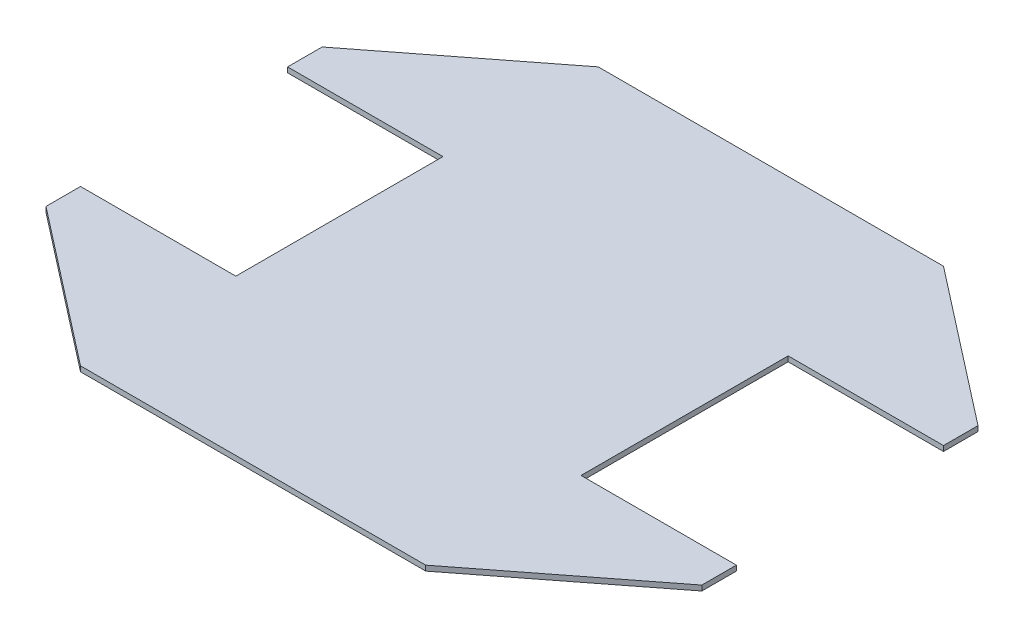
ISO-10303-21;
HEADER;
FILE_DESCRIPTION(('STEP AP214'),'2;1');
FILE_NAME('part.step','',(''),(''),'','','');
FILE_SCHEMA(('AUTOMOTIVE_DESIGN { 1 0 10303 214 1 1 1 1 }'));
ENDSEC;
DATA;
#1=APPLICATION_CONTEXT('core data for automotive mechanical design processes');
#2=APPLICATION_PROTOCOL_DEFINITION('international standard','automotive_design',2000,#1);
#3=PRODUCT_CONTEXT('',#1,'mechanical');
#4=PRODUCT('Part','Part','',(#3));
#5=PRODUCT_RELATED_PRODUCT_CATEGORY('part','',(#4));
#6=PRODUCT_DEFINITION_FORMATION('','',#4);
#7=PRODUCT_DEFINITION_CONTEXT('part definition',#1,'design');
#8=PRODUCT_DEFINITION('design','',#6,#7);
#9=PRODUCT_DEFINITION_SHAPE('','',#8);
#10=(LENGTH_UNIT() NAMED_UNIT(*) SI_UNIT(.MILLI.,.METRE.));
#11=(NAMED_UNIT(*) PLANE_ANGLE_UNIT() SI_UNIT($,.RADIAN.));
#12=(NAMED_UNIT(*) SI_UNIT($,.STERADIAN.) SOLID_ANGLE_UNIT());
#13=UNCERTAINTY_MEASURE_WITH_UNIT(LENGTH_MEASURE(1.E-05),#10,'distance_accuracy_value','');
#14=(GEOMETRIC_REPRESENTATION_CONTEXT(3) GLOBAL_UNCERTAINTY_ASSIGNED_CONTEXT((#13)) GLOBAL_UNIT_ASSIGNED_CONTEXT((#10,
#11,#12)) REPRESENTATION_CONTEXT('',''));
#15=CARTESIAN_POINT('',(0.,0.,0.));
#16=DIRECTION('',(0.,0.,1.));
#17=DIRECTION('',(1.,0.,0.));
#18=AXIS2_PLACEMENT_3D('',#15,#16,#17);
#19=CARTESIAN_POINT('',(-190.,3.,-80.));
#20=DIRECTION('',(0.61394061351492,0.,0.789352217376326));
#21=DIRECTION('',(0.789352217376326,0.,-0.613940613514921));
#22=AXIS2_PLACEMENT_3D('',#19,#20,#21);
#23=PLANE('',#22);
#24=DIRECTION('',(-0.789352217376326,0.,0.613940613514921));
#25=VECTOR('',#24,1.);
#26=CARTESIAN_POINT('',(-190.,0.,-80.));
#27=LINE('',#26,#25);
#28=CARTESIAN_POINT('',(-100.,0.,-150.));
#29=VERTEX_POINT('',#28);
#30=CARTESIAN_POINT('',(-190.,0.,-80.));
#31=VERTEX_POINT('',#30);
#32=EDGE_CURVE('E177',#29,#31,#27,.T.);
#33=ORIENTED_EDGE('',*,*,#32,.T.);
#34=DIRECTION('',(0.,-1.,0.));
#35=VECTOR('',#34,1.);
#36=CARTESIAN_POINT('',(-190.,3.,-80.));
#37=LINE('',#36,#35);
#38=CARTESIAN_POINT('',(-190.,3.,-80.));
#39=VERTEX_POINT('',#38);
#40=EDGE_CURVE('E11',#39,#31,#37,.T.);
#41=ORIENTED_EDGE('',*,*,#40,.F.);
#42=DIRECTION('',(-0.789352217376326,0.,0.613940613514921));
#43=VECTOR('',#42,1.);
#44=CARTESIAN_POINT('',(-190.,3.,-80.));
#45=LINE('',#44,#43);
#46=CARTESIAN_POINT('',(-100.,3.,-150.));
#47=VERTEX_POINT('',#46);
#48=EDGE_CURVE('E207',#47,#39,#45,.T.);
#49=ORIENTED_EDGE('',*,*,#48,.F.);
#50=DIRECTION('',(0.,-1.,0.));
#51=VECTOR('',#50,1.);
#52=CARTESIAN_POINT('',(-100.,3.,-150.));
#53=LINE('',#52,#51);
#54=EDGE_CURVE('E173',#47,#29,#53,.T.);
#55=ORIENTED_EDGE('',*,*,#54,.T.);
#56=EDGE_LOOP('',(#33,#41,#49,#55));
#57=FACE_BOUND('',#56,.T.);
#58=ADVANCED_FACE('F33',(#57),#23,.F.);
#59=CARTESIAN_POINT('',(-190.,3.,-60.));
#60=DIRECTION('',(1.,0.,0.));
#61=DIRECTION('',(0.,0.,-1.));
#62=AXIS2_PLACEMENT_3D('',#59,#60,#61);
#63=PLANE('',#62);
#64=DIRECTION('',(0.,0.,1.));
#65=VECTOR('',#64,1.);
#66=CARTESIAN_POINT('',(-190.,0.,-60.));
#67=LINE('',#66,#65);
#68=CARTESIAN_POINT('',(-190.,0.,-60.));
#69=VERTEX_POINT('',#68);
#70=EDGE_CURVE('E180',#31,#69,#67,.T.);
#71=ORIENTED_EDGE('',*,*,#70,.T.);
#72=DIRECTION('',(0.,-1.,0.));
#73=VECTOR('',#72,1.);
#74=CARTESIAN_POINT('',(-190.,3.,-60.));
#75=LINE('',#74,#73);
#76=CARTESIAN_POINT('',(-190.,3.,-60.));
#77=VERTEX_POINT('',#76);
#78=EDGE_CURVE('E41',#77,#69,#75,.T.);
#79=ORIENTED_EDGE('',*,*,#78,.F.);
#80=DIRECTION('',(0.,0.,1.));
#81=VECTOR('',#80,1.);
#82=CARTESIAN_POINT('',(-190.,3.,-60.));
#83=LINE('',#82,#81);
#84=EDGE_CURVE('E116',#39,#77,#83,.T.);
#85=ORIENTED_EDGE('',*,*,#84,.F.);
#86=ORIENTED_EDGE('',*,*,#40,.T.);
#87=EDGE_LOOP('',(#71,#79,#85,#86));
#88=FACE_BOUND('',#87,.T.);
#89=ADVANCED_FACE('F305',(#88),#63,.F.);
#90=CARTESIAN_POINT('',(-100.,3.,-60.));
#91=DIRECTION('',(0.,0.,-1.));
#92=DIRECTION('',(-1.,0.,0.));
#93=AXIS2_PLACEMENT_3D('',#90,#91,#92);
#94=PLANE('',#93);
#95=DIRECTION('',(1.,0.,0.));
#96=VECTOR('',#95,1.);
#97=CARTESIAN_POINT('',(-100.,0.,-60.));
#98=LINE('',#97,#96);
#99=CARTESIAN_POINT('',(-100.,0.,-60.));
#100=VERTEX_POINT('',#99);
#101=EDGE_CURVE('E182',#69,#100,#98,.T.);
#102=ORIENTED_EDGE('',*,*,#101,.T.);
#103=DIRECTION('',(0.,-1.,0.));
#104=VECTOR('',#103,1.);
#105=CARTESIAN_POINT('',(-100.,3.,-60.));
#106=LINE('',#105,#104);
#107=CARTESIAN_POINT('',(-100.,3.,-60.));
#108=VERTEX_POINT('',#107);
#109=EDGE_CURVE('E238',#108,#100,#106,.T.);
#110=ORIENTED_EDGE('',*,*,#109,.F.);
#111=DIRECTION('',(1.,0.,0.));
#112=VECTOR('',#111,1.);
#113=CARTESIAN_POINT('',(-100.,3.,-60.));
#114=LINE('',#113,#112);
#115=EDGE_CURVE('E246',#77,#108,#114,.T.);
#116=ORIENTED_EDGE('',*,*,#115,.F.);
#117=ORIENTED_EDGE('',*,*,#78,.T.);
#118=EDGE_LOOP('',(#102,#110,#116,#117));
#119=FACE_BOUND('',#118,.T.);
#120=ADVANCED_FACE('F244',(#119),#94,.F.);
#121=CARTESIAN_POINT('',(-100.,3.,60.));
#122=DIRECTION('',(1.,0.,0.));
#123=DIRECTION('',(0.,0.,-1.));
#124=AXIS2_PLACEMENT_3D('',#121,#122,#123);
#125=PLANE('',#124);
#126=DIRECTION('',(0.,0.,1.));
#127=VECTOR('',#126,1.);
#128=CARTESIAN_POINT('',(-100.,0.,60.));
#129=LINE('',#128,#127);
#130=CARTESIAN_POINT('',(-100.,0.,60.));
#131=VERTEX_POINT('',#130);
#132=EDGE_CURVE('E184',#100,#131,#129,.T.);
#133=ORIENTED_EDGE('',*,*,#132,.T.);
#134=DIRECTION('',(0.,-1.,0.));
#135=VECTOR('',#134,1.);
#136=CARTESIAN_POINT('',(-100.,3.,60.));
#137=LINE('',#136,#135);
#138=CARTESIAN_POINT('',(-100.,3.,60.));
#139=VERTEX_POINT('',#138);
#140=EDGE_CURVE('E235',#139,#131,#137,.T.);
#141=ORIENTED_EDGE('',*,*,#140,.F.);
#142=DIRECTION('',(0.,0.,1.));
#143=VECTOR('',#142,1.);
#144=CARTESIAN_POINT('',(-100.,3.,60.));
#145=LINE('',#144,#143);
#146=EDGE_CURVE('E264',#108,#139,#145,.T.);
#147=ORIENTED_EDGE('',*,*,#146,.F.);
#148=ORIENTED_EDGE('',*,*,#109,.T.);
#149=EDGE_LOOP('',(#133,#141,#147,#148));
#150=FACE_BOUND('',#149,.T.);
#151=ADVANCED_FACE('F255',(#150),#125,.F.);
#152=CARTESIAN_POINT('',(-190.,3.,60.));
#153=DIRECTION('',(0.,0.,1.));
#154=DIRECTION('',(1.,0.,0.));
#155=AXIS2_PLACEMENT_3D('',#152,#153,#154);
#156=PLANE('',#155);
#157=DIRECTION('',(-1.,0.,0.));
#158=VECTOR('',#157,1.);
#159=CARTESIAN_POINT('',(-190.,0.,60.));
#160=LINE('',#159,#158);
#161=CARTESIAN_POINT('',(-190.,0.,60.));
#162=VERTEX_POINT('',#161);
#163=EDGE_CURVE('E186',#131,#162,#160,.T.);
#164=ORIENTED_EDGE('',*,*,#163,.T.);
#165=DIRECTION('',(0.,-1.,0.));
#166=VECTOR('',#165,1.);
#167=CARTESIAN_POINT('',(-190.,3.,60.));
#168=LINE('',#167,#166);
#169=CARTESIAN_POINT('',(-190.,3.,60.));
#170=VERTEX_POINT('',#169);
#171=EDGE_CURVE('E232',#170,#162,#168,.T.);
#172=ORIENTED_EDGE('',*,*,#171,.F.);
#173=DIRECTION('',(-1.,0.,0.));
#174=VECTOR('',#173,1.);
#175=CARTESIAN_POINT('',(-190.,3.,60.));
#176=LINE('',#175,#174);
#177=EDGE_CURVE('E261',#139,#170,#176,.T.);
#178=ORIENTED_EDGE('',*,*,#177,.F.);
#179=ORIENTED_EDGE('',*,*,#140,.T.);
#180=EDGE_LOOP('',(#164,#172,#178,#179));
#181=FACE_BOUND('',#180,.T.);
#182=ADVANCED_FACE('F259',(#181),#156,.F.);
#183=CARTESIAN_POINT('',(-190.,3.,80.));
#184=DIRECTION('',(1.,0.,0.));
#185=DIRECTION('',(0.,0.,-1.));
#186=AXIS2_PLACEMENT_3D('',#183,#184,#185);
#187=PLANE('',#186);
#188=DIRECTION('',(0.,0.,1.));
#189=VECTOR('',#188,1.);
#190=CARTESIAN_POINT('',(-190.,0.,80.));
#191=LINE('',#190,#189);
#192=CARTESIAN_POINT('',(-190.,0.,80.));
#193=VERTEX_POINT('',#192);
#194=EDGE_CURVE('E188',#162,#193,#191,.T.);
#195=ORIENTED_EDGE('',*,*,#194,.T.);
#196=DIRECTION('',(0.,-1.,0.));
#197=VECTOR('',#196,1.);
#198=CARTESIAN_POINT('',(-190.,3.,80.));
#199=LINE('',#198,#197);
#200=CARTESIAN_POINT('',(-190.,3.,80.));
#201=VERTEX_POINT('',#200);
#202=EDGE_CURVE('E229',#201,#193,#199,.T.);
#203=ORIENTED_EDGE('',*,*,#202,.F.);
#204=DIRECTION('',(0.,0.,1.));
#205=VECTOR('',#204,1.);
#206=CARTESIAN_POINT('',(-190.,3.,80.));
#207=LINE('',#206,#205);
#208=EDGE_CURVE('E263',#170,#201,#207,.T.);
#209=ORIENTED_EDGE('',*,*,#208,.F.);
#210=ORIENTED_EDGE('',*,*,#171,.T.);
#211=EDGE_LOOP('',(#195,#203,#209,#210));
#212=FACE_BOUND('',#211,.T.);
#213=ADVANCED_FACE('F318',(#212),#187,.F.);
#214=CARTESIAN_POINT('',(-99.9999999999999,3.,150.));
#215=DIRECTION('',(0.61394061351492,0.,-0.789352217376326));
#216=DIRECTION('',(-0.789352217376326,0.,-0.613940613514921));
#217=AXIS2_PLACEMENT_3D('',#214,#215,#216);
#218=PLANE('',#217);
#219=DIRECTION('',(0.789352217376326,0.,0.613940613514921));
#220=VECTOR('',#219,1.);
#221=CARTESIAN_POINT('',(-99.9999999999999,0.,150.));
#222=LINE('',#221,#220);
#223=CARTESIAN_POINT('',(-99.9999999999999,0.,150.));
#224=VERTEX_POINT('',#223);
#225=EDGE_CURVE('E190',#193,#224,#222,.T.);
#226=ORIENTED_EDGE('',*,*,#225,.T.);
#227=DIRECTION('',(0.,-1.,0.));
#228=VECTOR('',#227,1.);
#229=CARTESIAN_POINT('',(-99.9999999999999,3.,150.));
#230=LINE('',#229,#228);
#231=CARTESIAN_POINT('',(-99.9999999999999,3.,150.));
#232=VERTEX_POINT('',#231);
#233=EDGE_CURVE('E226',#232,#224,#230,.T.);
#234=ORIENTED_EDGE('',*,*,#233,.F.);
#235=DIRECTION('',(0.789352217376326,0.,0.613940613514921));
#236=VECTOR('',#235,1.);
#237=CARTESIAN_POINT('',(-99.9999999999999,3.,150.));
#238=LINE('',#237,#236);
#239=EDGE_CURVE('E266',#201,#232,#238,.T.);
#240=ORIENTED_EDGE('',*,*,#239,.F.);
#241=ORIENTED_EDGE('',*,*,#202,.T.);
#242=EDGE_LOOP('',(#226,#234,#240,#241));
#243=FACE_BOUND('',#242,.T.);
#244=ADVANCED_FACE('F321',(#243),#218,.F.);
#245=CARTESIAN_POINT('',(100.,3.,150.));
#246=DIRECTION('',(0.,0.,-1.));
#247=DIRECTION('',(-1.,0.,0.));
#248=AXIS2_PLACEMENT_3D('',#245,#246,#247);
#249=PLANE('',#248);
#250=DIRECTION('',(1.,0.,0.));
#251=VECTOR('',#250,1.);
#252=CARTESIAN_POINT('',(100.,0.,150.));
#253=LINE('',#252,#251);
#254=CARTESIAN_POINT('',(100.,0.,150.));
#255=VERTEX_POINT('',#254);
#256=EDGE_CURVE('E192',#224,#255,#253,.T.);
#257=ORIENTED_EDGE('',*,*,#256,.T.);
#258=DIRECTION('',(0.,-1.,0.));
#259=VECTOR('',#258,1.);
#260=CARTESIAN_POINT('',(100.,3.,150.));
#261=LINE('',#260,#259);
#262=CARTESIAN_POINT('',(100.,3.,150.));
#263=VERTEX_POINT('',#262);
#264=EDGE_CURVE('E223',#263,#255,#261,.T.);
#265=ORIENTED_EDGE('',*,*,#264,.F.);
#266=DIRECTION('',(1.,0.,0.));
#267=VECTOR('',#266,1.);
#268=CARTESIAN_POINT('',(100.,3.,150.));
#269=LINE('',#268,#267);
#270=EDGE_CURVE('E272',#232,#263,#269,.T.);
#271=ORIENTED_EDGE('',*,*,#270,.F.);
#272=ORIENTED_EDGE('',*,*,#233,.T.);
#273=EDGE_LOOP('',(#257,#265,#271,#272));
#274=FACE_BOUND('',#273,.T.);
#275=ADVANCED_FACE('F325',(#274),#249,.F.);
#276=CARTESIAN_POINT('',(190.,3.,80.));
#277=DIRECTION('',(-0.61394061351492,0.,-0.789352217376326));
#278=DIRECTION('',(-0.789352217376326,0.,0.61394061351492));
#279=AXIS2_PLACEMENT_3D('',#276,#277,#278);
#280=PLANE('',#279);
#281=DIRECTION('',(0.789352217376326,0.,-0.61394061351492));
#282=VECTOR('',#281,1.);
#283=CARTESIAN_POINT('',(190.,0.,80.));
#284=LINE('',#283,#282);
#285=CARTESIAN_POINT('',(190.,0.,80.));
#286=VERTEX_POINT('',#285);
#287=EDGE_CURVE('E194',#255,#286,#284,.T.);
#288=ORIENTED_EDGE('',*,*,#287,.T.);
#289=DIRECTION('',(0.,-1.,0.));
#290=VECTOR('',#289,1.);
#291=CARTESIAN_POINT('',(190.,3.,80.));
#292=LINE('',#291,#290);
#293=CARTESIAN_POINT('',(190.,3.,80.));
#294=VERTEX_POINT('',#293);
#295=EDGE_CURVE('E220',#294,#286,#292,.T.);
#296=ORIENTED_EDGE('',*,*,#295,.F.);
#297=DIRECTION('',(0.789352217376326,0.,-0.61394061351492));
#298=VECTOR('',#297,1.);
#299=CARTESIAN_POINT('',(190.,3.,80.));
#300=LINE('',#299,#298);
#301=EDGE_CURVE('E274',#263,#294,#300,.T.);
#302=ORIENTED_EDGE('',*,*,#301,.F.);
#303=ORIENTED_EDGE('',*,*,#264,.T.);
#304=EDGE_LOOP('',(#288,#296,#302,#303));
#305=FACE_BOUND('',#304,.T.);
#306=ADVANCED_FACE('F329',(#305),#280,.F.);
#307=CARTESIAN_POINT('',(190.,3.,60.));
#308=DIRECTION('',(-1.,0.,0.));
#309=DIRECTION('',(0.,0.,1.));
#310=AXIS2_PLACEMENT_3D('',#307,#308,#309);
#311=PLANE('',#310);
#312=DIRECTION('',(0.,0.,-1.));
#313=VECTOR('',#312,1.);
#314=CARTESIAN_POINT('',(190.,0.,60.));
#315=LINE('',#314,#313);
#316=CARTESIAN_POINT('',(190.,0.,60.));
#317=VERTEX_POINT('',#316);
#318=EDGE_CURVE('E196',#286,#317,#315,.T.);
#319=ORIENTED_EDGE('',*,*,#318,.T.);
#320=DIRECTION('',(0.,-1.,0.));
#321=VECTOR('',#320,1.);
#322=CARTESIAN_POINT('',(190.,3.,60.));
#323=LINE('',#322,#321);
#324=CARTESIAN_POINT('',(190.,3.,60.));
#325=VERTEX_POINT('',#324);
#326=EDGE_CURVE('E217',#325,#317,#323,.T.);
#327=ORIENTED_EDGE('',*,*,#326,.F.);
#328=DIRECTION('',(0.,0.,-1.));
#329=VECTOR('',#328,1.);
#330=CARTESIAN_POINT('',(190.,3.,60.));
#331=LINE('',#330,#329);
#332=EDGE_CURVE('E276',#294,#325,#331,.T.);
#333=ORIENTED_EDGE('',*,*,#332,.F.);
#334=ORIENTED_EDGE('',*,*,#295,.T.);
#335=EDGE_LOOP('',(#319,#327,#333,#334));
#336=FACE_BOUND('',#335,.T.);
#337=ADVANCED_FACE('F333',(#336),#311,.F.);
#338=CARTESIAN_POINT('',(100.,3.,60.));
#339=DIRECTION('',(0.,0.,1.));
#340=DIRECTION('',(1.,0.,0.));
#341=AXIS2_PLACEMENT_3D('',#338,#339,#340);
#342=PLANE('',#341);
#343=DIRECTION('',(-1.,0.,0.));
#344=VECTOR('',#343,1.);
#345=CARTESIAN_POINT('',(100.,0.,60.));
#346=LINE('',#345,#344);
#347=CARTESIAN_POINT('',(100.,0.,60.));
#348=VERTEX_POINT('',#347);
#349=EDGE_CURVE('E198',#317,#348,#346,.T.);
#350=ORIENTED_EDGE('',*,*,#349,.T.);
#351=DIRECTION('',(0.,-1.,0.));
#352=VECTOR('',#351,1.);
#353=CARTESIAN_POINT('',(100.,3.,60.));
#354=LINE('',#353,#352);
#355=CARTESIAN_POINT('',(100.,3.,60.));
#356=VERTEX_POINT('',#355);
#357=EDGE_CURVE('E214',#356,#348,#354,.T.);
#358=ORIENTED_EDGE('',*,*,#357,.F.);
#359=DIRECTION('',(-1.,0.,0.));
#360=VECTOR('',#359,1.);
#361=CARTESIAN_POINT('',(100.,3.,60.));
#362=LINE('',#361,#360);
#363=EDGE_CURVE('E278',#325,#356,#362,.T.);
#364=ORIENTED_EDGE('',*,*,#363,.F.);
#365=ORIENTED_EDGE('',*,*,#326,.T.);
#366=EDGE_LOOP('',(#350,#358,#364,#365));
#367=FACE_BOUND('',#366,.T.);
#368=ADVANCED_FACE('F337',(#367),#342,.F.);
#369=CARTESIAN_POINT('',(100.,3.,-60.));
#370=DIRECTION('',(-1.,0.,0.));
#371=DIRECTION('',(0.,0.,1.));
#372=AXIS2_PLACEMENT_3D('',#369,#370,#371);
#373=PLANE('',#372);
#374=DIRECTION('',(0.,0.,-1.));
#375=VECTOR('',#374,1.);
#376=CARTESIAN_POINT('',(100.,0.,-60.));
#377=LINE('',#376,#375);
#378=CARTESIAN_POINT('',(100.,0.,-60.));
#379=VERTEX_POINT('',#378);
#380=EDGE_CURVE('E200',#348,#379,#377,.T.);
#381=ORIENTED_EDGE('',*,*,#380,.T.);
#382=DIRECTION('',(0.,-1.,0.));
#383=VECTOR('',#382,1.);
#384=CARTESIAN_POINT('',(100.,3.,-60.));
#385=LINE('',#384,#383);
#386=CARTESIAN_POINT('',(100.,3.,-60.));
#387=VERTEX_POINT('',#386);
#388=EDGE_CURVE('E211',#387,#379,#385,.T.);
#389=ORIENTED_EDGE('',*,*,#388,.F.);
#390=DIRECTION('',(0.,0.,-1.));
#391=VECTOR('',#390,1.);
#392=CARTESIAN_POINT('',(100.,3.,-60.));
#393=LINE('',#392,#391);
#394=EDGE_CURVE('E280',#356,#387,#393,.T.);
#395=ORIENTED_EDGE('',*,*,#394,.F.);
#396=ORIENTED_EDGE('',*,*,#357,.T.);
#397=EDGE_LOOP('',(#381,#389,#395,#396));
#398=FACE_BOUND('',#397,.T.);
#399=ADVANCED_FACE('F286',(#398),#373,.F.);
#400=CARTESIAN_POINT('',(190.,3.,-60.));
#401=DIRECTION('',(0.,0.,-1.));
#402=DIRECTION('',(-1.,0.,0.));
#403=AXIS2_PLACEMENT_3D('',#400,#401,#402);
#404=PLANE('',#403);
#405=DIRECTION('',(1.,0.,0.));
#406=VECTOR('',#405,1.);
#407=CARTESIAN_POINT('',(190.,0.,-60.));
#408=LINE('',#407,#406);
#409=CARTESIAN_POINT('',(190.,0.,-60.));
#410=VERTEX_POINT('',#409);
#411=EDGE_CURVE('E202',#379,#410,#408,.T.);
#412=ORIENTED_EDGE('',*,*,#411,.T.);
#413=DIRECTION('',(0.,-1.,0.));
#414=VECTOR('',#413,1.);
#415=CARTESIAN_POINT('',(190.,3.,-60.));
#416=LINE('',#415,#414);
#417=CARTESIAN_POINT('',(190.,3.,-60.));
#418=VERTEX_POINT('',#417);
#419=EDGE_CURVE('E168',#418,#410,#416,.T.);
#420=ORIENTED_EDGE('',*,*,#419,.F.);
#421=DIRECTION('',(1.,0.,0.));
#422=VECTOR('',#421,1.);
#423=CARTESIAN_POINT('',(190.,3.,-60.));
#424=LINE('',#423,#422);
#425=EDGE_CURVE('E159',#387,#418,#424,.T.);
#426=ORIENTED_EDGE('',*,*,#425,.F.);
#427=ORIENTED_EDGE('',*,*,#388,.T.);
#428=EDGE_LOOP('',(#412,#420,#426,#427));
#429=FACE_BOUND('',#428,.T.);
#430=ADVANCED_FACE('F290',(#429),#404,.F.);
#431=CARTESIAN_POINT('',(190.,3.,-80.));
#432=DIRECTION('',(-1.,0.,0.));
#433=DIRECTION('',(0.,0.,1.));
#434=AXIS2_PLACEMENT_3D('',#431,#432,#433);
#435=PLANE('',#434);
#436=DIRECTION('',(0.,0.,-1.));
#437=VECTOR('',#436,1.);
#438=CARTESIAN_POINT('',(190.,0.,-80.));
#439=LINE('',#438,#437);
#440=CARTESIAN_POINT('',(190.,0.,-80.));
#441=VERTEX_POINT('',#440);
#442=EDGE_CURVE('E167',#410,#441,#439,.T.);
#443=ORIENTED_EDGE('',*,*,#442,.T.);
#444=DIRECTION('',(0.,-1.,0.));
#445=VECTOR('',#444,1.);
#446=CARTESIAN_POINT('',(190.,3.,-80.));
#447=LINE('',#446,#445);
#448=CARTESIAN_POINT('',(190.,3.,-80.));
#449=VERTEX_POINT('',#448);
#450=EDGE_CURVE('E164',#449,#441,#447,.T.);
#451=ORIENTED_EDGE('',*,*,#450,.F.);
#452=DIRECTION('',(0.,0.,-1.));
#453=VECTOR('',#452,1.);
#454=CARTESIAN_POINT('',(190.,3.,-80.));
#455=LINE('',#454,#453);
#456=EDGE_CURVE('E153',#418,#449,#455,.T.);
#457=ORIENTED_EDGE('',*,*,#456,.F.);
#458=ORIENTED_EDGE('',*,*,#419,.T.);
#459=EDGE_LOOP('',(#443,#451,#457,#458));
#460=FACE_BOUND('',#459,.T.);
#461=ADVANCED_FACE('F165',(#460),#435,.F.);
#462=CARTESIAN_POINT('',(100.,3.,-150.));
#463=DIRECTION('',(-0.61394061351492,0.,0.789352217376327));
#464=DIRECTION('',(0.789352217376327,0.,0.61394061351492));
#465=AXIS2_PLACEMENT_3D('',#462,#463,#464);
#466=PLANE('',#465);
#467=DIRECTION('',(-0.789352217376327,0.,-0.61394061351492));
#468=VECTOR('',#467,1.);
#469=CARTESIAN_POINT('',(100.,0.,-150.));
#470=LINE('',#469,#468);
#471=CARTESIAN_POINT('',(100.,0.,-150.));
#472=VERTEX_POINT('',#471);
#473=EDGE_CURVE('E102',#441,#472,#470,.T.);
#474=ORIENTED_EDGE('',*,*,#473,.T.);
#475=DIRECTION('',(0.,-1.,0.));
#476=VECTOR('',#475,1.);
#477=CARTESIAN_POINT('',(100.,3.,-150.));
#478=LINE('',#477,#476);
#479=CARTESIAN_POINT('',(100.,3.,-150.));
#480=VERTEX_POINT('',#479);
#481=EDGE_CURVE('E169',#480,#472,#478,.T.);
#482=ORIENTED_EDGE('',*,*,#481,.F.);
#483=DIRECTION('',(-0.789352217376327,0.,-0.61394061351492));
#484=VECTOR('',#483,1.);
#485=CARTESIAN_POINT('',(100.,3.,-150.));
#486=LINE('',#485,#484);
#487=EDGE_CURVE('E157',#449,#480,#486,.T.);
#488=ORIENTED_EDGE('',*,*,#487,.F.);
#489=ORIENTED_EDGE('',*,*,#450,.T.);
#490=EDGE_LOOP('',(#474,#482,#488,#489));
#491=FACE_BOUND('',#490,.T.);
#492=ADVANCED_FACE('F171',(#491),#466,.F.);
#493=CARTESIAN_POINT('',(-100.,3.,-150.));
#494=DIRECTION('',(0.,0.,1.));
#495=DIRECTION('',(1.,0.,0.));
#496=AXIS2_PLACEMENT_3D('',#493,#494,#495);
#497=PLANE('',#496);
#498=DIRECTION('',(-1.,0.,0.));
#499=VECTOR('',#498,1.);
#500=CARTESIAN_POINT('',(-100.,0.,-150.));
#501=LINE('',#500,#499);
#502=EDGE_CURVE('E108',#472,#29,#501,.T.);
#503=ORIENTED_EDGE('',*,*,#502,.T.);
#504=ORIENTED_EDGE('',*,*,#54,.F.);
#505=DIRECTION('',(-1.,0.,0.));
#506=VECTOR('',#505,1.);
#507=CARTESIAN_POINT('',(-100.,3.,-150.));
#508=LINE('',#507,#506);
#509=EDGE_CURVE('E49',#480,#47,#508,.T.);
#510=ORIENTED_EDGE('',*,*,#509,.F.);
#511=ORIENTED_EDGE('',*,*,#481,.T.);
#512=EDGE_LOOP('',(#503,#504,#510,#511));
#513=FACE_BOUND('',#512,.T.);
#514=ADVANCED_FACE('F294',(#513),#497,.F.);
#515=CARTESIAN_POINT('',(0.,3.,0.));
#516=DIRECTION('',(0.,-1.,0.));
#517=DIRECTION('',(0.,0.,-1.));
#518=AXIS2_PLACEMENT_3D('',#515,#516,#517);
#519=PLANE('',#518);
#520=ORIENTED_EDGE('',*,*,#48,.T.);
#521=ORIENTED_EDGE('',*,*,#84,.T.);
#522=ORIENTED_EDGE('',*,*,#115,.T.);
#523=ORIENTED_EDGE('',*,*,#146,.T.);
#524=ORIENTED_EDGE('',*,*,#177,.T.);
#525=ORIENTED_EDGE('',*,*,#208,.T.);
#526=ORIENTED_EDGE('',*,*,#239,.T.);
#527=ORIENTED_EDGE('',*,*,#270,.T.);
#528=ORIENTED_EDGE('',*,*,#301,.T.);
#529=ORIENTED_EDGE('',*,*,#332,.T.);
#530=ORIENTED_EDGE('',*,*,#363,.T.);
#531=ORIENTED_EDGE('',*,*,#394,.T.);
#532=ORIENTED_EDGE('',*,*,#425,.T.);
#533=ORIENTED_EDGE('',*,*,#456,.T.);
#534=ORIENTED_EDGE('',*,*,#487,.T.);
#535=ORIENTED_EDGE('',*,*,#509,.T.);
#536=EDGE_LOOP('',(#520,#521,#522,#523,#524,#525,#526,#527,#528,#529,#530,#531,#532,#533,#534,#535));
#537=FACE_BOUND('',#536,.T.);
#538=ADVANCED_FACE('F155',(#537),#519,.F.);
#539=CARTESIAN_POINT('',(0.,0.,0.));
#540=DIRECTION('',(0.,-1.,0.));
#541=DIRECTION('',(0.,0.,-1.));
#542=AXIS2_PLACEMENT_3D('',#539,#540,#541);
#543=PLANE('',#542);
#544=ORIENTED_EDGE('',*,*,#32,.F.);
#545=ORIENTED_EDGE('',*,*,#502,.F.);
#546=ORIENTED_EDGE('',*,*,#473,.F.);
#547=ORIENTED_EDGE('',*,*,#442,.F.);
#548=ORIENTED_EDGE('',*,*,#411,.F.);
#549=ORIENTED_EDGE('',*,*,#380,.F.);
#550=ORIENTED_EDGE('',*,*,#349,.F.);
#551=ORIENTED_EDGE('',*,*,#318,.F.);
#552=ORIENTED_EDGE('',*,*,#287,.F.);
#553=ORIENTED_EDGE('',*,*,#256,.F.);
#554=ORIENTED_EDGE('',*,*,#225,.F.);
#555=ORIENTED_EDGE('',*,*,#194,.F.);
#556=ORIENTED_EDGE('',*,*,#163,.F.);
#557=ORIENTED_EDGE('',*,*,#132,.F.);
#558=ORIENTED_EDGE('',*,*,#101,.F.);
#559=ORIENTED_EDGE('',*,*,#70,.F.);
#560=EDGE_LOOP('',(#544,#545,#546,#547,#548,#549,#550,#551,#552,#553,#554,#555,#556,#557,#558,#559));
#561=FACE_BOUND('',#560,.T.);
#562=ADVANCED_FACE('F250',(#561),#543,.T.);
#563=CLOSED_SHELL('',(#58,#89,#120,#151,#182,#213,#244,#275,#306,#337,#368,#399,#430,#461,#492,
#514,#538,#562));
#564=MANIFOLD_SOLID_BREP('B2',#563);
#565=ADVANCED_BREP_SHAPE_REPRESENTATION('',(#18,#564),#14);
#566=SHAPE_DEFINITION_REPRESENTATION(#9,#565);
ENDSEC;
END-ISO-10303-21;
